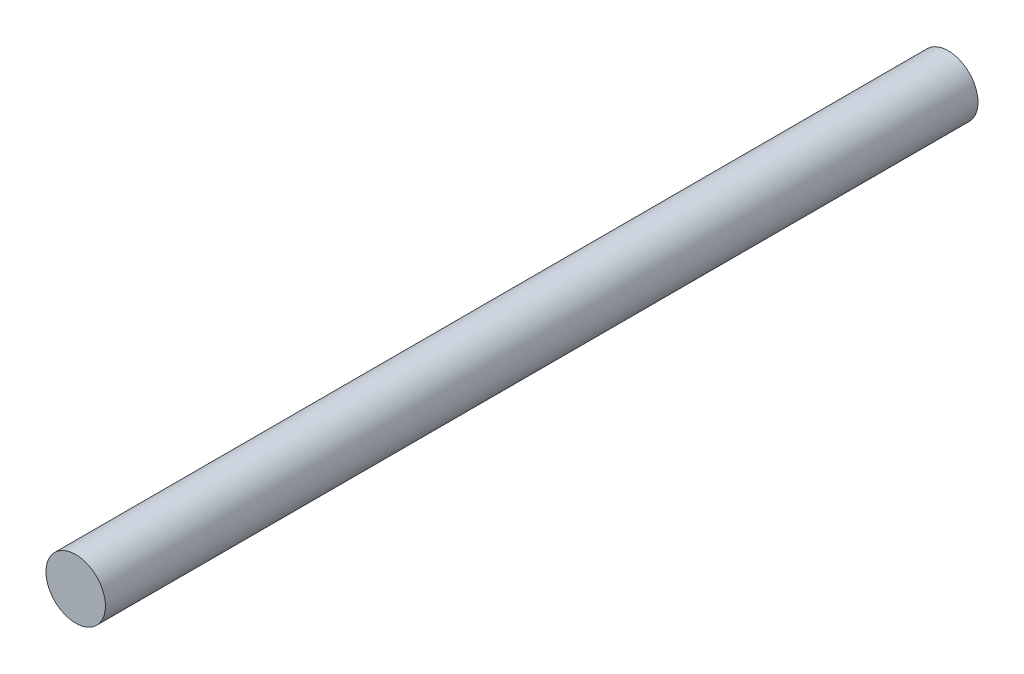
ISO-10303-21;
HEADER;
FILE_DESCRIPTION(('STEP AP214'),'2;1');
FILE_NAME('part.step','',(''),(''),'','','');
FILE_SCHEMA(('AUTOMOTIVE_DESIGN { 1 0 10303 214 1 1 1 1 }'));
ENDSEC;
DATA;
#1=APPLICATION_CONTEXT('core data for automotive mechanical design processes');
#2=APPLICATION_PROTOCOL_DEFINITION('international standard','automotive_design',2000,#1);
#3=PRODUCT_CONTEXT('',#1,'mechanical');
#4=PRODUCT('Part','Part','',(#3));
#5=PRODUCT_RELATED_PRODUCT_CATEGORY('part','',(#4));
#6=PRODUCT_DEFINITION_FORMATION('','',#4);
#7=PRODUCT_DEFINITION_CONTEXT('part definition',#1,'design');
#8=PRODUCT_DEFINITION('design','',#6,#7);
#9=PRODUCT_DEFINITION_SHAPE('','',#8);
#10=(LENGTH_UNIT() NAMED_UNIT(*) SI_UNIT(.MILLI.,.METRE.));
#11=(NAMED_UNIT(*) PLANE_ANGLE_UNIT() SI_UNIT($,.RADIAN.));
#12=(NAMED_UNIT(*) SI_UNIT($,.STERADIAN.) SOLID_ANGLE_UNIT());
#13=UNCERTAINTY_MEASURE_WITH_UNIT(LENGTH_MEASURE(1.E-05),#10,'distance_accuracy_value','');
#14=(GEOMETRIC_REPRESENTATION_CONTEXT(3) GLOBAL_UNCERTAINTY_ASSIGNED_CONTEXT((#13)) GLOBAL_UNIT_ASSIGNED_CONTEXT((#10,
#11,#12)) REPRESENTATION_CONTEXT('',''));
#15=CARTESIAN_POINT('',(0.,0.,0.));
#16=DIRECTION('',(0.,0.,1.));
#17=DIRECTION('',(1.,0.,0.));
#18=AXIS2_PLACEMENT_3D('',#15,#16,#17);
#19=CARTESIAN_POINT('',(0.,0.,139.7));
#20=DIRECTION('',(0.,0.,-1.));
#21=DIRECTION('',(-1.,0.,0.));
#22=AXIS2_PLACEMENT_3D('',#19,#20,#21);
#23=CYLINDRICAL_SURFACE('',#22,4.7625);
#24=CARTESIAN_POINT('',(0.,0.,139.7));
#25=DIRECTION('',(0.,0.,1.));
#26=DIRECTION('',(1.,0.,0.));
#27=AXIS2_PLACEMENT_3D('',#24,#25,#26);
#28=CIRCLE('',#27,4.7625);
#29=CARTESIAN_POINT('',(4.7625,0.,139.7));
#30=VERTEX_POINT('',#29);
#31=EDGE_CURVE('E10',#30,#30,#28,.T.);
#32=ORIENTED_EDGE('',*,*,#31,.F.);
#33=EDGE_LOOP('',(#32));
#34=FACE_BOUND('',#33,.T.);
#35=CARTESIAN_POINT('',(0.,0.,0.));
#36=DIRECTION('',(0.,0.,1.));
#37=DIRECTION('',(1.,0.,0.));
#38=AXIS2_PLACEMENT_3D('',#35,#36,#37);
#39=CIRCLE('',#38,4.7625);
#40=CARTESIAN_POINT('',(4.7625,0.,0.));
#41=VERTEX_POINT('',#40);
#42=EDGE_CURVE('E33',#41,#41,#39,.T.);
#43=ORIENTED_EDGE('',*,*,#42,.T.);
#44=EDGE_LOOP('',(#43));
#45=FACE_BOUND('',#44,.T.);
#46=ADVANCED_FACE('F30',(#34,#45),#23,.T.);
#47=CARTESIAN_POINT('',(0.,0.,139.7));
#48=DIRECTION('',(0.,0.,1.));
#49=DIRECTION('',(1.,0.,0.));
#50=AXIS2_PLACEMENT_3D('',#47,#48,#49);
#51=PLANE('',#50);
#52=ORIENTED_EDGE('',*,*,#31,.T.);
#53=EDGE_LOOP('',(#52));
#54=FACE_BOUND('',#53,.T.);
#55=ADVANCED_FACE('F45',(#54),#51,.T.);
#56=CARTESIAN_POINT('',(0.,0.,0.));
#57=DIRECTION('',(0.,0.,1.));
#58=DIRECTION('',(1.,0.,0.));
#59=AXIS2_PLACEMENT_3D('',#56,#57,#58);
#60=PLANE('',#59);
#61=ORIENTED_EDGE('',*,*,#42,.F.);
#62=EDGE_LOOP('',(#61));
#63=FACE_BOUND('',#62,.T.);
#64=ADVANCED_FACE('F43',(#63),#60,.F.);
#65=CLOSED_SHELL('',(#46,#55,#64));
#66=MANIFOLD_SOLID_BREP('B2',#65);
#67=ADVANCED_BREP_SHAPE_REPRESENTATION('',(#18,#66),#14);
#68=SHAPE_DEFINITION_REPRESENTATION(#9,#67);
ENDSEC;
END-ISO-10303-21;
